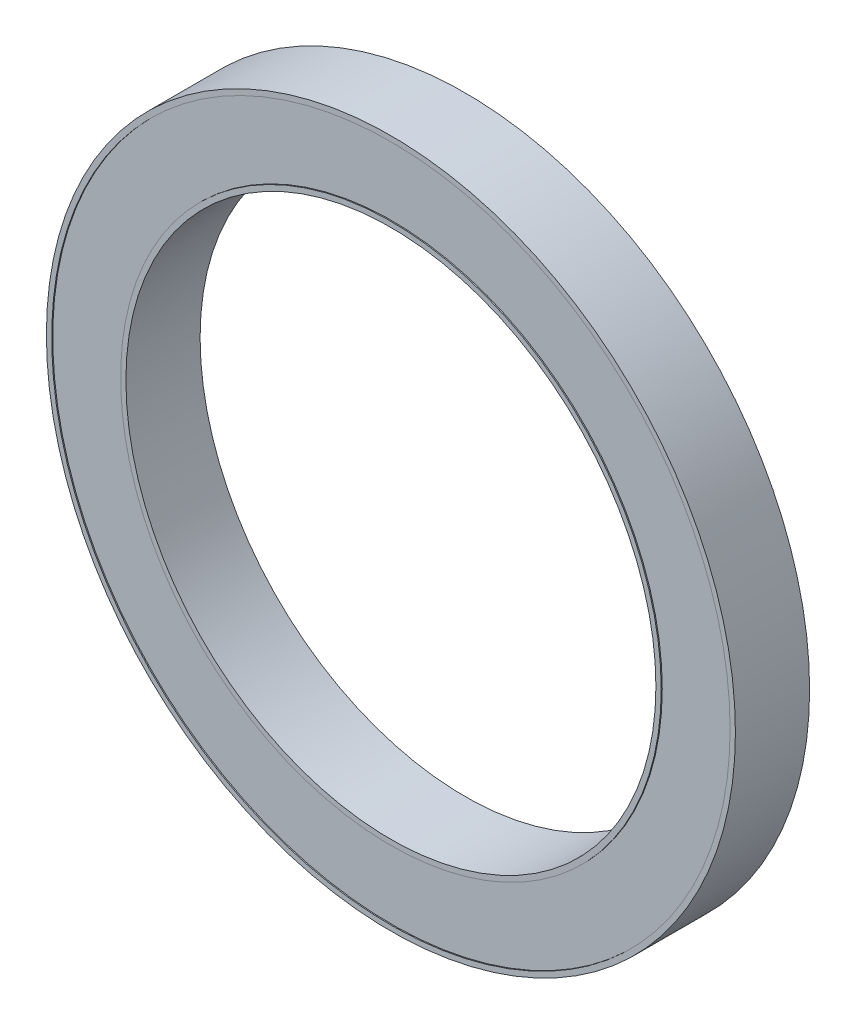
ISO-10303-21;
HEADER;
FILE_DESCRIPTION(('STEP AP214'),'2;1');
FILE_NAME('part.step','',(''),(''),'','','');
FILE_SCHEMA(('AUTOMOTIVE_DESIGN { 1 0 10303 214 1 1 1 1 }'));
ENDSEC;
DATA;
#1=APPLICATION_CONTEXT('core data for automotive mechanical design processes');
#2=APPLICATION_PROTOCOL_DEFINITION('international standard','automotive_design',2000,#1);
#3=PRODUCT_CONTEXT('',#1,'mechanical');
#4=PRODUCT('Part','Part','',(#3));
#5=PRODUCT_RELATED_PRODUCT_CATEGORY('part','',(#4));
#6=PRODUCT_DEFINITION_FORMATION('','',#4);
#7=PRODUCT_DEFINITION_CONTEXT('part definition',#1,'design');
#8=PRODUCT_DEFINITION('design','',#6,#7);
#9=PRODUCT_DEFINITION_SHAPE('','',#8);
#10=(LENGTH_UNIT() NAMED_UNIT(*) SI_UNIT(.MILLI.,.METRE.));
#11=(NAMED_UNIT(*) PLANE_ANGLE_UNIT() SI_UNIT($,.RADIAN.));
#12=(NAMED_UNIT(*) SI_UNIT($,.STERADIAN.) SOLID_ANGLE_UNIT());
#13=UNCERTAINTY_MEASURE_WITH_UNIT(LENGTH_MEASURE(1.E-05),#10,'distance_accuracy_value','');
#14=(GEOMETRIC_REPRESENTATION_CONTEXT(3) GLOBAL_UNCERTAINTY_ASSIGNED_CONTEXT((#13)) GLOBAL_UNIT_ASSIGNED_CONTEXT((#10,
#11,#12)) REPRESENTATION_CONTEXT('',''));
#15=CARTESIAN_POINT('',(0.,0.,0.));
#16=DIRECTION('',(0.,0.,1.));
#17=DIRECTION('',(1.,0.,0.));
#18=AXIS2_PLACEMENT_3D('',#15,#16,#17);
#19=CARTESIAN_POINT('',(0.,0.,7.));
#20=DIRECTION('',(0.,0.,1.));
#21=DIRECTION('',(1.,0.,0.));
#22=AXIS2_PLACEMENT_3D('',#19,#20,#21);
#23=PLANE('',#22);
#24=CARTESIAN_POINT('',(0.,0.,7.));
#25=DIRECTION('',(0.,0.,1.));
#26=DIRECTION('',(1.,0.,0.));
#27=AXIS2_PLACEMENT_3D('',#24,#25,#26);
#28=CIRCLE('',#27,25.);
#29=CARTESIAN_POINT('',(25.,0.,7.));
#30=VERTEX_POINT('',#29);
#31=EDGE_CURVE('E48',#30,#30,#28,.T.);
#32=ORIENTED_EDGE('',*,*,#31,.F.);
#33=EDGE_LOOP('',(#32));
#34=FACE_BOUND('',#33,.T.);
#35=CARTESIAN_POINT('',(0.,0.,7.));
#36=DIRECTION('',(0.,0.,1.));
#37=DIRECTION('',(1.,0.,0.));
#38=AXIS2_PLACEMENT_3D('',#35,#36,#37);
#39=CIRCLE('',#38,25.5);
#40=CARTESIAN_POINT('',(25.5,0.,7.));
#41=VERTEX_POINT('',#40);
#42=EDGE_CURVE('E74',#41,#41,#39,.T.);
#43=ORIENTED_EDGE('',*,*,#42,.T.);
#44=EDGE_LOOP('',(#43));
#45=FACE_BOUND('',#44,.T.);
#46=ADVANCED_FACE('F37',(#34,#45),#23,.T.);
#47=CARTESIAN_POINT('',(0.,0.,0.));
#48=DIRECTION('',(0.,0.,1.));
#49=DIRECTION('',(1.,0.,0.));
#50=AXIS2_PLACEMENT_3D('',#47,#48,#49);
#51=PLANE('',#50);
#52=CARTESIAN_POINT('',(0.,0.,0.));
#53=DIRECTION('',(0.,0.,1.));
#54=DIRECTION('',(1.,0.,0.));
#55=AXIS2_PLACEMENT_3D('',#52,#53,#54);
#56=CIRCLE('',#55,25.);
#57=CARTESIAN_POINT('',(25.,0.,0.));
#58=VERTEX_POINT('',#57);
#59=EDGE_CURVE('E50',#58,#58,#56,.T.);
#60=ORIENTED_EDGE('',*,*,#59,.T.);
#61=EDGE_LOOP('',(#60));
#62=FACE_BOUND('',#61,.T.);
#63=CARTESIAN_POINT('',(0.,0.,0.));
#64=DIRECTION('',(0.,0.,-1.));
#65=DIRECTION('',(-1.,0.,0.));
#66=AXIS2_PLACEMENT_3D('',#63,#64,#65);
#67=CIRCLE('',#66,25.5);
#68=CARTESIAN_POINT('',(-25.5,0.,0.));
#69=VERTEX_POINT('',#68);
#70=EDGE_CURVE('E62',#69,#69,#67,.T.);
#71=ORIENTED_EDGE('',*,*,#70,.T.);
#72=EDGE_LOOP('',(#71));
#73=FACE_BOUND('',#72,.T.);
#74=ADVANCED_FACE('F99',(#62,#73),#51,.F.);
#75=CARTESIAN_POINT('',(0.,0.,7.));
#76=DIRECTION('',(0.,0.,1.));
#77=DIRECTION('',(1.,0.,0.));
#78=AXIS2_PLACEMENT_3D('',#75,#76,#77);
#79=CIRCLE('',#78,32.);
#80=CARTESIAN_POINT('',(32.,0.,7.));
#81=VERTEX_POINT('',#80);
#82=EDGE_CURVE('E68',#81,#81,#79,.T.);
#83=ORIENTED_EDGE('',*,*,#82,.F.);
#84=EDGE_LOOP('',(#83));
#85=FACE_BOUND('',#84,.T.);
#86=CARTESIAN_POINT('',(0.,0.,7.));
#87=DIRECTION('',(0.,0.,1.));
#88=DIRECTION('',(1.,0.,0.));
#89=AXIS2_PLACEMENT_3D('',#86,#87,#88);
#90=CIRCLE('',#89,32.5);
#91=CARTESIAN_POINT('',(32.5,0.,7.));
#92=VERTEX_POINT('',#91);
#93=EDGE_CURVE('E10',#92,#92,#90,.T.);
#94=ORIENTED_EDGE('',*,*,#93,.T.);
#95=EDGE_LOOP('',(#94));
#96=FACE_BOUND('',#95,.T.);
#97=ADVANCED_FACE('F96',(#85,#96),#23,.T.);
#98=CARTESIAN_POINT('',(0.,0.,0.));
#99=DIRECTION('',(0.,0.,-1.));
#100=DIRECTION('',(-1.,0.,0.));
#101=AXIS2_PLACEMENT_3D('',#98,#99,#100);
#102=CIRCLE('',#101,32.);
#103=CARTESIAN_POINT('',(-32.,0.,0.));
#104=VERTEX_POINT('',#103);
#105=EDGE_CURVE('E56',#104,#104,#102,.T.);
#106=ORIENTED_EDGE('',*,*,#105,.F.);
#107=EDGE_LOOP('',(#106));
#108=FACE_BOUND('',#107,.T.);
#109=CARTESIAN_POINT('',(0.,0.,0.));
#110=DIRECTION('',(0.,0.,1.));
#111=DIRECTION('',(1.,0.,0.));
#112=AXIS2_PLACEMENT_3D('',#109,#110,#111);
#113=CIRCLE('',#112,32.5);
#114=CARTESIAN_POINT('',(32.5,0.,0.));
#115=VERTEX_POINT('',#114);
#116=EDGE_CURVE('E41',#115,#115,#113,.T.);
#117=ORIENTED_EDGE('',*,*,#116,.F.);
#118=EDGE_LOOP('',(#117));
#119=FACE_BOUND('',#118,.T.);
#120=ADVANCED_FACE('F98',(#108,#119),#51,.F.);
#121=CARTESIAN_POINT('',(0.,0.,7.));
#122=DIRECTION('',(0.,0.,-1.));
#123=DIRECTION('',(-1.,0.,0.));
#124=AXIS2_PLACEMENT_3D('',#121,#122,#123);
#125=CYLINDRICAL_SURFACE('',#124,32.5);
#126=ORIENTED_EDGE('',*,*,#93,.F.);
#127=EDGE_LOOP('',(#126));
#128=FACE_BOUND('',#127,.T.);
#129=ORIENTED_EDGE('',*,*,#116,.T.);
#130=EDGE_LOOP('',(#129));
#131=FACE_BOUND('',#130,.T.);
#132=ADVANCED_FACE('F39',(#128,#131),#125,.T.);
#133=CARTESIAN_POINT('',(0.,0.,7.));
#134=DIRECTION('',(0.,0.,-1.));
#135=DIRECTION('',(-1.,0.,0.));
#136=AXIS2_PLACEMENT_3D('',#133,#134,#135);
#137=CYLINDRICAL_SURFACE('',#136,25.);
#138=ORIENTED_EDGE('',*,*,#31,.T.);
#139=EDGE_LOOP('',(#138));
#140=FACE_BOUND('',#139,.T.);
#141=ORIENTED_EDGE('',*,*,#59,.F.);
#142=EDGE_LOOP('',(#141));
#143=FACE_BOUND('',#142,.T.);
#144=ADVANCED_FACE('F129',(#140,#143),#137,.F.);
#145=CARTESIAN_POINT('',(0.,0.,0.1));
#146=DIRECTION('',(0.,0.,-1.));
#147=DIRECTION('',(-1.,0.,0.));
#148=AXIS2_PLACEMENT_3D('',#145,#146,#147);
#149=CYLINDRICAL_SURFACE('',#148,32.);
#150=CARTESIAN_POINT('',(0.,0.,0.1));
#151=DIRECTION('',(0.,0.,-1.));
#152=DIRECTION('',(-1.,0.,0.));
#153=AXIS2_PLACEMENT_3D('',#150,#151,#152);
#154=CIRCLE('',#153,32.);
#155=CARTESIAN_POINT('',(-32.,0.,0.1));
#156=VERTEX_POINT('',#155);
#157=EDGE_CURVE('E53',#156,#156,#154,.T.);
#158=ORIENTED_EDGE('',*,*,#157,.F.);
#159=EDGE_LOOP('',(#158));
#160=FACE_BOUND('',#159,.T.);
#161=ORIENTED_EDGE('',*,*,#105,.T.);
#162=EDGE_LOOP('',(#161));
#163=FACE_BOUND('',#162,.T.);
#164=ADVANCED_FACE('F126',(#160,#163),#149,.F.);
#165=CARTESIAN_POINT('',(0.,0.,0.1));
#166=DIRECTION('',(0.,0.,-1.));
#167=DIRECTION('',(-1.,0.,0.));
#168=AXIS2_PLACEMENT_3D('',#165,#166,#167);
#169=PLANE('',#168);
#170=CARTESIAN_POINT('',(0.,0.,0.1));
#171=DIRECTION('',(0.,0.,-1.));
#172=DIRECTION('',(-1.,0.,0.));
#173=AXIS2_PLACEMENT_3D('',#170,#171,#172);
#174=CIRCLE('',#173,25.5);
#175=CARTESIAN_POINT('',(-25.5,0.,0.1));
#176=VERTEX_POINT('',#175);
#177=EDGE_CURVE('E59',#176,#176,#174,.T.);
#178=ORIENTED_EDGE('',*,*,#177,.F.);
#179=EDGE_LOOP('',(#178));
#180=FACE_BOUND('',#179,.T.);
#181=ORIENTED_EDGE('',*,*,#157,.T.);
#182=EDGE_LOOP('',(#181));
#183=FACE_BOUND('',#182,.T.);
#184=ADVANCED_FACE('F122',(#180,#183),#169,.T.);
#185=CARTESIAN_POINT('',(0.,0.,0.1));
#186=DIRECTION('',(0.,0.,-1.));
#187=DIRECTION('',(-1.,0.,0.));
#188=AXIS2_PLACEMENT_3D('',#185,#186,#187);
#189=CYLINDRICAL_SURFACE('',#188,25.5);
#190=ORIENTED_EDGE('',*,*,#177,.T.);
#191=EDGE_LOOP('',(#190));
#192=FACE_BOUND('',#191,.T.);
#193=ORIENTED_EDGE('',*,*,#70,.F.);
#194=EDGE_LOOP('',(#193));
#195=FACE_BOUND('',#194,.T.);
#196=ADVANCED_FACE('F92',(#192,#195),#189,.T.);
#197=CARTESIAN_POINT('',(0.,0.,6.9));
#198=DIRECTION('',(0.,0.,1.));
#199=DIRECTION('',(1.,0.,0.));
#200=AXIS2_PLACEMENT_3D('',#197,#198,#199);
#201=CYLINDRICAL_SURFACE('',#200,32.);
#202=CARTESIAN_POINT('',(0.,0.,6.9));
#203=DIRECTION('',(0.,0.,1.));
#204=DIRECTION('',(1.,0.,0.));
#205=AXIS2_PLACEMENT_3D('',#202,#203,#204);
#206=CIRCLE('',#205,32.);
#207=CARTESIAN_POINT('',(32.,0.,6.9));
#208=VERTEX_POINT('',#207);
#209=EDGE_CURVE('E65',#208,#208,#206,.T.);
#210=ORIENTED_EDGE('',*,*,#209,.F.);
#211=EDGE_LOOP('',(#210));
#212=FACE_BOUND('',#211,.T.);
#213=ORIENTED_EDGE('',*,*,#82,.T.);
#214=EDGE_LOOP('',(#213));
#215=FACE_BOUND('',#214,.T.);
#216=ADVANCED_FACE('F86',(#212,#215),#201,.F.);
#217=CARTESIAN_POINT('',(0.,0.,6.9));
#218=DIRECTION('',(0.,0.,1.));
#219=DIRECTION('',(1.,0.,0.));
#220=AXIS2_PLACEMENT_3D('',#217,#218,#219);
#221=PLANE('',#220);
#222=CARTESIAN_POINT('',(0.,0.,6.9));
#223=DIRECTION('',(0.,0.,1.));
#224=DIRECTION('',(1.,0.,0.));
#225=AXIS2_PLACEMENT_3D('',#222,#223,#224);
#226=CIRCLE('',#225,25.5);
#227=CARTESIAN_POINT('',(25.5,0.,6.9));
#228=VERTEX_POINT('',#227);
#229=EDGE_CURVE('E71',#228,#228,#226,.T.);
#230=ORIENTED_EDGE('',*,*,#229,.F.);
#231=EDGE_LOOP('',(#230));
#232=FACE_BOUND('',#231,.T.);
#233=ORIENTED_EDGE('',*,*,#209,.T.);
#234=EDGE_LOOP('',(#233));
#235=FACE_BOUND('',#234,.T.);
#236=ADVANCED_FACE('F83',(#232,#235),#221,.T.);
#237=CARTESIAN_POINT('',(0.,0.,6.9));
#238=DIRECTION('',(0.,0.,1.));
#239=DIRECTION('',(1.,0.,0.));
#240=AXIS2_PLACEMENT_3D('',#237,#238,#239);
#241=CYLINDRICAL_SURFACE('',#240,25.5);
#242=ORIENTED_EDGE('',*,*,#229,.T.);
#243=EDGE_LOOP('',(#242));
#244=FACE_BOUND('',#243,.T.);
#245=ORIENTED_EDGE('',*,*,#42,.F.);
#246=EDGE_LOOP('',(#245));
#247=FACE_BOUND('',#246,.T.);
#248=ADVANCED_FACE('F80',(#244,#247),#241,.T.);
#249=CLOSED_SHELL('',(#46,#74,#97,#120,#132,#144,#164,#184,#196,#216,#236,#248));
#250=MANIFOLD_SOLID_BREP('B2',#249);
#251=ADVANCED_BREP_SHAPE_REPRESENTATION('',(#18,#250),#14);
#252=SHAPE_DEFINITION_REPRESENTATION(#9,#251);
ENDSEC;
END-ISO-10303-21;
